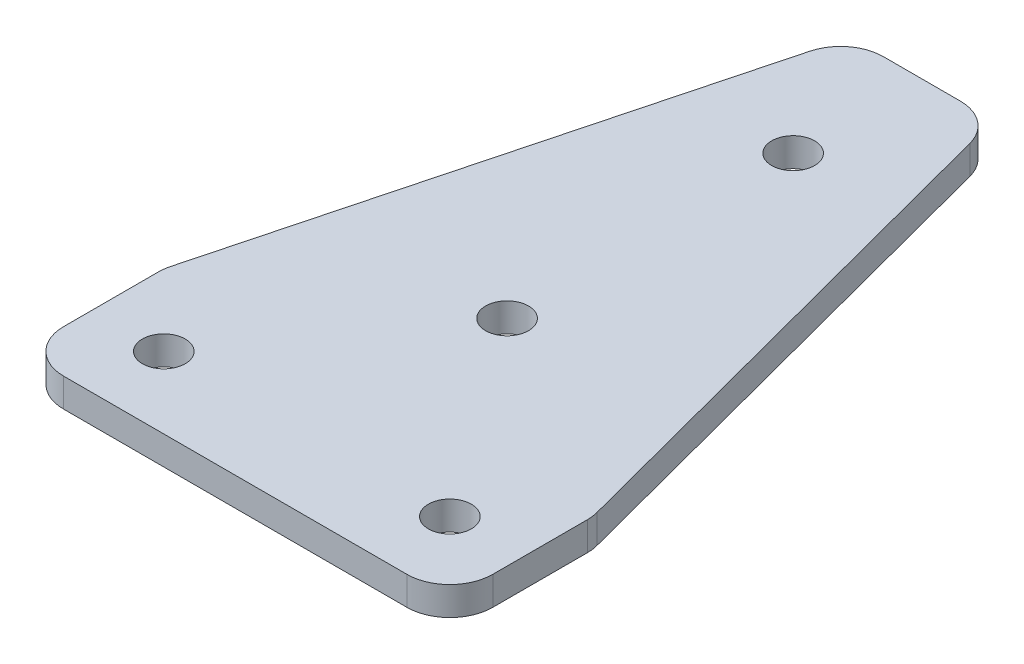
ISO-10303-21;
HEADER;
FILE_DESCRIPTION(('STEP AP214'),'2;1');
FILE_NAME('part.step','',(''),(''),'','','');
FILE_SCHEMA(('AUTOMOTIVE_DESIGN { 1 0 10303 214 1 1 1 1 }'));
ENDSEC;
DATA;
#1=APPLICATION_CONTEXT('core data for automotive mechanical design processes');
#2=APPLICATION_PROTOCOL_DEFINITION('international standard','automotive_design',2000,#1);
#3=PRODUCT_CONTEXT('',#1,'mechanical');
#4=PRODUCT('Part','Part','',(#3));
#5=PRODUCT_RELATED_PRODUCT_CATEGORY('part','',(#4));
#6=PRODUCT_DEFINITION_FORMATION('','',#4);
#7=PRODUCT_DEFINITION_CONTEXT('part definition',#1,'design');
#8=PRODUCT_DEFINITION('design','',#6,#7);
#9=PRODUCT_DEFINITION_SHAPE('','',#8);
#10=(LENGTH_UNIT() NAMED_UNIT(*) SI_UNIT(.MILLI.,.METRE.));
#11=(NAMED_UNIT(*) PLANE_ANGLE_UNIT() SI_UNIT($,.RADIAN.));
#12=(NAMED_UNIT(*) SI_UNIT($,.STERADIAN.) SOLID_ANGLE_UNIT());
#13=UNCERTAINTY_MEASURE_WITH_UNIT(LENGTH_MEASURE(1.E-05),#10,'distance_accuracy_value','');
#14=(GEOMETRIC_REPRESENTATION_CONTEXT(3) GLOBAL_UNCERTAINTY_ASSIGNED_CONTEXT((#13)) GLOBAL_UNIT_ASSIGNED_CONTEXT((#10,
#11,#12)) REPRESENTATION_CONTEXT('',''));
#15=CARTESIAN_POINT('',(0.,0.,0.));
#16=DIRECTION('',(0.,0.,1.));
#17=DIRECTION('',(1.,0.,0.));
#18=AXIS2_PLACEMENT_3D('',#15,#16,#17);
#19=CARTESIAN_POINT('',(0.,2.,0.));
#20=DIRECTION('',(0.,-1.,0.));
#21=DIRECTION('',(0.,0.,-1.));
#22=AXIS2_PLACEMENT_3D('',#19,#20,#21);
#23=PLANE('',#22);
#24=DIRECTION('',(-1.,0.,0.));
#25=VECTOR('',#24,1.);
#26=CARTESIAN_POINT('',(-5.,2.,-48.));
#27=LINE('',#26,#25);
#28=CARTESIAN_POINT('',(2.6873343098334,2.,-48.));
#29=VERTEX_POINT('',#28);
#30=CARTESIAN_POINT('',(-2.6873343098334,2.,-48.));
#31=VERTEX_POINT('',#30);
#32=EDGE_CURVE('E177',#29,#31,#27,.T.);
#33=ORIENTED_EDGE('',*,*,#32,.T.);
#34=CARTESIAN_POINT('',(-2.6873343098334,2.,-45.));
#35=DIRECTION('',(0.,-1.,0.));
#36=DIRECTION('',(0.,0.,-1.));
#37=AXIS2_PLACEMENT_3D('',#34,#35,#36);
#38=CIRCLE('',#37,3.);
#39=CARTESIAN_POINT('',(-5.58855792162133,2.,-45.7634798978389));
#40=VERTEX_POINT('',#39);
#41=EDGE_CURVE('E226',#31,#40,#38,.F.);
#42=ORIENTED_EDGE('',*,*,#41,.T.);
#43=DIRECTION('',(-0.254493299279644,0.,0.967074537262646));
#44=VECTOR('',#43,1.);
#45=CARTESIAN_POINT('',(-15.,2.,-10.));
#46=LINE('',#45,#44);
#47=CARTESIAN_POINT('',(-14.9012236117879,2.,-10.3753502752058));
#48=VERTEX_POINT('',#47);
#49=EDGE_CURVE('E159',#40,#48,#46,.T.);
#50=ORIENTED_EDGE('',*,*,#49,.T.);
#51=CARTESIAN_POINT('',(-12.,2.,-9.61187037736691));
#52=DIRECTION('',(0.,-1.,0.));
#53=DIRECTION('',(0.,0.,-1.));
#54=AXIS2_PLACEMENT_3D('',#51,#52,#53);
#55=CIRCLE('',#54,3.);
#56=CARTESIAN_POINT('',(-15.,2.,-9.61187037736691));
#57=VERTEX_POINT('',#56);
#58=EDGE_CURVE('E220',#48,#57,#55,.F.);
#59=ORIENTED_EDGE('',*,*,#58,.T.);
#60=DIRECTION('',(0.,0.,1.));
#61=VECTOR('',#60,1.);
#62=CARTESIAN_POINT('',(-15.,2.,-10.));
#63=LINE('',#62,#61);
#64=CARTESIAN_POINT('',(-15.,2.,-3.00000000000002));
#65=VERTEX_POINT('',#64);
#66=EDGE_CURVE('E259',#57,#65,#63,.T.);
#67=ORIENTED_EDGE('',*,*,#66,.T.);
#68=CARTESIAN_POINT('',(-12.,2.,-3.00000000000002));
#69=DIRECTION('',(0.,-1.,0.));
#70=DIRECTION('',(0.,0.,-1.));
#71=AXIS2_PLACEMENT_3D('',#68,#69,#70);
#72=CIRCLE('',#71,3.);
#73=CARTESIAN_POINT('',(-12.,2.,0.));
#74=VERTEX_POINT('',#73);
#75=EDGE_CURVE('E219',#65,#74,#72,.F.);
#76=ORIENTED_EDGE('',*,*,#75,.T.);
#77=DIRECTION('',(1.,0.,0.));
#78=VECTOR('',#77,1.);
#79=CARTESIAN_POINT('',(-15.,2.,0.));
#80=LINE('',#79,#78);
#81=CARTESIAN_POINT('',(12.,2.,0.));
#82=VERTEX_POINT('',#81);
#83=EDGE_CURVE('E272',#74,#82,#80,.T.);
#84=ORIENTED_EDGE('',*,*,#83,.T.);
#85=CARTESIAN_POINT('',(12.,2.,-3.));
#86=DIRECTION('',(0.,-1.,0.));
#87=DIRECTION('',(0.,0.,-1.));
#88=AXIS2_PLACEMENT_3D('',#85,#86,#87);
#89=CIRCLE('',#88,3.);
#90=CARTESIAN_POINT('',(15.,2.,-3.));
#91=VERTEX_POINT('',#90);
#92=EDGE_CURVE('E211',#82,#91,#89,.F.);
#93=ORIENTED_EDGE('',*,*,#92,.T.);
#94=DIRECTION('',(0.,0.,-1.));
#95=VECTOR('',#94,1.);
#96=CARTESIAN_POINT('',(15.,2.,-10.));
#97=LINE('',#96,#95);
#98=CARTESIAN_POINT('',(15.,2.,-9.61187037736689));
#99=VERTEX_POINT('',#98);
#100=EDGE_CURVE('E274',#91,#99,#97,.T.);
#101=ORIENTED_EDGE('',*,*,#100,.T.);
#102=CARTESIAN_POINT('',(12.,2.,-9.61187037736689));
#103=DIRECTION('',(0.,-1.,0.));
#104=DIRECTION('',(0.,0.,-1.));
#105=AXIS2_PLACEMENT_3D('',#102,#103,#104);
#106=CIRCLE('',#105,3.);
#107=CARTESIAN_POINT('',(14.9012236117879,2.,-10.3753502752058));
#108=VERTEX_POINT('',#107);
#109=EDGE_CURVE('E68',#99,#108,#106,.F.);
#110=ORIENTED_EDGE('',*,*,#109,.T.);
#111=DIRECTION('',(-0.254493299279644,0.,-0.967074537262646));
#112=VECTOR('',#111,1.);
#113=CARTESIAN_POINT('',(5.,2.,-48.));
#114=LINE('',#113,#112);
#115=CARTESIAN_POINT('',(5.58855792162134,2.,-45.7634798978389));
#116=VERTEX_POINT('',#115);
#117=EDGE_CURVE('E279',#108,#116,#114,.T.);
#118=ORIENTED_EDGE('',*,*,#117,.T.);
#119=CARTESIAN_POINT('',(2.6873343098334,2.,-45.));
#120=DIRECTION('',(0.,-1.,0.));
#121=DIRECTION('',(0.,0.,-1.));
#122=AXIS2_PLACEMENT_3D('',#119,#120,#121);
#123=CIRCLE('',#122,3.);
#124=EDGE_CURVE('E221',#116,#29,#123,.F.);
#125=ORIENTED_EDGE('',*,*,#124,.T.);
#126=EDGE_LOOP('',(#33,#42,#50,#59,#67,#76,#84,#93,#101,#110,#118,#125));
#127=FACE_BOUND('',#126,.T.);
#128=CARTESIAN_POINT('',(0.,2.,-39.));
#129=DIRECTION('',(0.,1.,0.));
#130=DIRECTION('',(0.,0.,1.));
#131=AXIS2_PLACEMENT_3D('',#128,#129,#130);
#132=CIRCLE('',#131,1.5);
#133=CARTESIAN_POINT('',(0.,2.,-37.5));
#134=VERTEX_POINT('',#133);
#135=EDGE_CURVE('E166',#134,#134,#132,.T.);
#136=ORIENTED_EDGE('',*,*,#135,.F.);
#137=EDGE_LOOP('',(#136));
#138=FACE_BOUND('',#137,.T.);
#139=CARTESIAN_POINT('',(0.,2.,-19.));
#140=DIRECTION('',(0.,1.,0.));
#141=DIRECTION('',(0.,0.,1.));
#142=AXIS2_PLACEMENT_3D('',#139,#140,#141);
#143=CIRCLE('',#142,1.5);
#144=CARTESIAN_POINT('',(0.,2.,-17.5));
#145=VERTEX_POINT('',#144);
#146=EDGE_CURVE('E462',#145,#145,#143,.T.);
#147=ORIENTED_EDGE('',*,*,#146,.F.);
#148=EDGE_LOOP('',(#147));
#149=FACE_BOUND('',#148,.T.);
#150=CARTESIAN_POINT('',(10.,2.,-5.));
#151=DIRECTION('',(0.,1.,0.));
#152=DIRECTION('',(0.,0.,1.));
#153=AXIS2_PLACEMENT_3D('',#150,#151,#152);
#154=CIRCLE('',#153,1.5);
#155=CARTESIAN_POINT('',(10.,2.,-3.5));
#156=VERTEX_POINT('',#155);
#157=EDGE_CURVE('E474',#156,#156,#154,.T.);
#158=ORIENTED_EDGE('',*,*,#157,.F.);
#159=EDGE_LOOP('',(#158));
#160=FACE_BOUND('',#159,.T.);
#161=CARTESIAN_POINT('',(-10.,2.,-5.));
#162=DIRECTION('',(0.,1.,0.));
#163=DIRECTION('',(0.,0.,1.));
#164=AXIS2_PLACEMENT_3D('',#161,#162,#163);
#165=CIRCLE('',#164,1.5);
#166=CARTESIAN_POINT('',(-10.,2.,-3.5));
#167=VERTEX_POINT('',#166);
#168=EDGE_CURVE('E477',#167,#167,#165,.T.);
#169=ORIENTED_EDGE('',*,*,#168,.F.);
#170=EDGE_LOOP('',(#169));
#171=FACE_BOUND('',#170,.T.);
#172=ADVANCED_FACE('F44',(#127,#138,#149,#160,#171),#23,.F.);
#173=CARTESIAN_POINT('',(0.,0.,0.));
#174=DIRECTION('',(0.,-1.,0.));
#175=DIRECTION('',(0.,0.,-1.));
#176=AXIS2_PLACEMENT_3D('',#173,#174,#175);
#177=PLANE('',#176);
#178=CARTESIAN_POINT('',(10.,0.,-5.));
#179=DIRECTION('',(0.,1.,0.));
#180=DIRECTION('',(0.,0.,1.));
#181=AXIS2_PLACEMENT_3D('',#178,#179,#180);
#182=CIRCLE('',#181,1.5);
#183=CARTESIAN_POINT('',(10.,0.,-3.5));
#184=VERTEX_POINT('',#183);
#185=EDGE_CURVE('E473',#184,#184,#182,.T.);
#186=ORIENTED_EDGE('',*,*,#185,.T.);
#187=EDGE_LOOP('',(#186));
#188=FACE_BOUND('',#187,.T.);
#189=CARTESIAN_POINT('',(0.,0.,-39.));
#190=DIRECTION('',(0.,1.,0.));
#191=DIRECTION('',(0.,0.,1.));
#192=AXIS2_PLACEMENT_3D('',#189,#190,#191);
#193=CIRCLE('',#192,1.5);
#194=CARTESIAN_POINT('',(0.,0.,-37.5));
#195=VERTEX_POINT('',#194);
#196=EDGE_CURVE('E176',#195,#195,#193,.T.);
#197=ORIENTED_EDGE('',*,*,#196,.T.);
#198=EDGE_LOOP('',(#197));
#199=FACE_BOUND('',#198,.T.);
#200=DIRECTION('',(-0.254493299279644,0.,0.967074537262646));
#201=VECTOR('',#200,1.);
#202=CARTESIAN_POINT('',(-15.,0.,-10.));
#203=LINE('',#202,#201);
#204=CARTESIAN_POINT('',(-5.58855792162133,0.,-45.7634798978389));
#205=VERTEX_POINT('',#204);
#206=CARTESIAN_POINT('',(-14.9012236117879,0.,-10.3753502752058));
#207=VERTEX_POINT('',#206);
#208=EDGE_CURVE('E152',#205,#207,#203,.T.);
#209=ORIENTED_EDGE('',*,*,#208,.F.);
#210=CARTESIAN_POINT('',(-2.6873343098334,0.,-45.));
#211=DIRECTION('',(0.,-1.,0.));
#212=DIRECTION('',(0.,0.,-1.));
#213=AXIS2_PLACEMENT_3D('',#210,#211,#212);
#214=CIRCLE('',#213,3.);
#215=CARTESIAN_POINT('',(-2.6873343098334,0.,-48.));
#216=VERTEX_POINT('',#215);
#217=EDGE_CURVE('E138',#205,#216,#214,.T.);
#218=ORIENTED_EDGE('',*,*,#217,.T.);
#219=DIRECTION('',(-1.,0.,0.));
#220=VECTOR('',#219,1.);
#221=CARTESIAN_POINT('',(-5.,0.,-48.));
#222=LINE('',#221,#220);
#223=CARTESIAN_POINT('',(2.6873343098334,0.,-48.));
#224=VERTEX_POINT('',#223);
#225=EDGE_CURVE('E195',#224,#216,#222,.T.);
#226=ORIENTED_EDGE('',*,*,#225,.F.);
#227=CARTESIAN_POINT('',(2.6873343098334,0.,-45.));
#228=DIRECTION('',(0.,-1.,0.));
#229=DIRECTION('',(0.,0.,-1.));
#230=AXIS2_PLACEMENT_3D('',#227,#228,#229);
#231=CIRCLE('',#230,3.);
#232=CARTESIAN_POINT('',(5.58855792162134,0.,-45.7634798978389));
#233=VERTEX_POINT('',#232);
#234=EDGE_CURVE('E149',#224,#233,#231,.T.);
#235=ORIENTED_EDGE('',*,*,#234,.T.);
#236=DIRECTION('',(-0.254493299279644,0.,-0.967074537262646));
#237=VECTOR('',#236,1.);
#238=CARTESIAN_POINT('',(5.,0.,-48.));
#239=LINE('',#238,#237);
#240=CARTESIAN_POINT('',(14.9012236117879,0.,-10.3753502752058));
#241=VERTEX_POINT('',#240);
#242=EDGE_CURVE('E186',#241,#233,#239,.T.);
#243=ORIENTED_EDGE('',*,*,#242,.F.);
#244=CARTESIAN_POINT('',(12.,0.,-9.61187037736689));
#245=DIRECTION('',(0.,-1.,0.));
#246=DIRECTION('',(0.,0.,-1.));
#247=AXIS2_PLACEMENT_3D('',#244,#245,#246);
#248=CIRCLE('',#247,3.);
#249=CARTESIAN_POINT('',(15.,0.,-9.61187037736689));
#250=VERTEX_POINT('',#249);
#251=EDGE_CURVE('E205',#241,#250,#248,.T.);
#252=ORIENTED_EDGE('',*,*,#251,.T.);
#253=DIRECTION('',(0.,0.,-1.));
#254=VECTOR('',#253,1.);
#255=CARTESIAN_POINT('',(15.,0.,-10.));
#256=LINE('',#255,#254);
#257=CARTESIAN_POINT('',(15.,0.,-3.));
#258=VERTEX_POINT('',#257);
#259=EDGE_CURVE('E184',#258,#250,#256,.T.);
#260=ORIENTED_EDGE('',*,*,#259,.F.);
#261=CARTESIAN_POINT('',(12.,0.,-3.));
#262=DIRECTION('',(0.,-1.,0.));
#263=DIRECTION('',(0.,0.,-1.));
#264=AXIS2_PLACEMENT_3D('',#261,#262,#263);
#265=CIRCLE('',#264,3.);
#266=CARTESIAN_POINT('',(12.,0.,0.));
#267=VERTEX_POINT('',#266);
#268=EDGE_CURVE('E160',#258,#267,#265,.T.);
#269=ORIENTED_EDGE('',*,*,#268,.T.);
#270=DIRECTION('',(1.,0.,0.));
#271=VECTOR('',#270,1.);
#272=CARTESIAN_POINT('',(-15.,0.,0.));
#273=LINE('',#272,#271);
#274=CARTESIAN_POINT('',(-12.,0.,0.));
#275=VERTEX_POINT('',#274);
#276=EDGE_CURVE('E173',#275,#267,#273,.T.);
#277=ORIENTED_EDGE('',*,*,#276,.F.);
#278=CARTESIAN_POINT('',(-12.,0.,-3.00000000000002));
#279=DIRECTION('',(0.,-1.,0.));
#280=DIRECTION('',(0.,0.,-1.));
#281=AXIS2_PLACEMENT_3D('',#278,#279,#280);
#282=CIRCLE('',#281,3.);
#283=CARTESIAN_POINT('',(-15.,0.,-3.00000000000002));
#284=VERTEX_POINT('',#283);
#285=EDGE_CURVE('E203',#275,#284,#282,.T.);
#286=ORIENTED_EDGE('',*,*,#285,.T.);
#287=DIRECTION('',(0.,0.,1.));
#288=VECTOR('',#287,1.);
#289=CARTESIAN_POINT('',(-15.,0.,-10.));
#290=LINE('',#289,#288);
#291=CARTESIAN_POINT('',(-15.,0.,-9.61187037736691));
#292=VERTEX_POINT('',#291);
#293=EDGE_CURVE('E170',#292,#284,#290,.T.);
#294=ORIENTED_EDGE('',*,*,#293,.F.);
#295=CARTESIAN_POINT('',(-12.,0.,-9.61187037736691));
#296=DIRECTION('',(0.,-1.,0.));
#297=DIRECTION('',(0.,0.,-1.));
#298=AXIS2_PLACEMENT_3D('',#295,#296,#297);
#299=CIRCLE('',#298,3.);
#300=EDGE_CURVE('E164',#292,#207,#299,.T.);
#301=ORIENTED_EDGE('',*,*,#300,.T.);
#302=EDGE_LOOP('',(#209,#218,#226,#235,#243,#252,#260,#269,#277,#286,#294,#301));
#303=FACE_BOUND('',#302,.T.);
#304=CARTESIAN_POINT('',(0.,0.,-19.));
#305=DIRECTION('',(0.,1.,0.));
#306=DIRECTION('',(0.,0.,1.));
#307=AXIS2_PLACEMENT_3D('',#304,#305,#306);
#308=CIRCLE('',#307,1.5);
#309=CARTESIAN_POINT('',(0.,0.,-17.5));
#310=VERTEX_POINT('',#309);
#311=EDGE_CURVE('E470',#310,#310,#308,.T.);
#312=ORIENTED_EDGE('',*,*,#311,.T.);
#313=EDGE_LOOP('',(#312));
#314=FACE_BOUND('',#313,.T.);
#315=CARTESIAN_POINT('',(-10.,0.,-5.));
#316=DIRECTION('',(0.,1.,0.));
#317=DIRECTION('',(0.,0.,1.));
#318=AXIS2_PLACEMENT_3D('',#315,#316,#317);
#319=CIRCLE('',#318,1.5);
#320=CARTESIAN_POINT('',(-10.,0.,-3.5));
#321=VERTEX_POINT('',#320);
#322=EDGE_CURVE('E482',#321,#321,#319,.T.);
#323=ORIENTED_EDGE('',*,*,#322,.T.);
#324=EDGE_LOOP('',(#323));
#325=FACE_BOUND('',#324,.T.);
#326=ADVANCED_FACE('F162',(#188,#199,#303,#314,#325),#177,.T.);
#327=CARTESIAN_POINT('',(-15.,2.,-10.));
#328=DIRECTION('',(0.967074537262646,0.,0.254493299279644));
#329=DIRECTION('',(0.254493299279644,0.,-0.967074537262647));
#330=AXIS2_PLACEMENT_3D('',#327,#328,#329);
#331=PLANE('',#330);
#332=ORIENTED_EDGE('',*,*,#49,.F.);
#333=DIRECTION('',(0.,-1.,0.));
#334=VECTOR('',#333,1.);
#335=CARTESIAN_POINT('',(-5.58855792162133,2.,-45.7634798978389));
#336=LINE('',#335,#334);
#337=EDGE_CURVE('E136',#40,#205,#336,.T.);
#338=ORIENTED_EDGE('',*,*,#337,.T.);
#339=ORIENTED_EDGE('',*,*,#208,.T.);
#340=DIRECTION('',(0.,-1.,0.));
#341=VECTOR('',#340,1.);
#342=CARTESIAN_POINT('',(-14.9012236117879,2.,-10.3753502752058));
#343=LINE('',#342,#341);
#344=EDGE_CURVE('E156',#207,#48,#343,.F.);
#345=ORIENTED_EDGE('',*,*,#344,.T.);
#346=EDGE_LOOP('',(#332,#338,#339,#345));
#347=FACE_BOUND('',#346,.T.);
#348=ADVANCED_FACE('F153',(#347),#331,.F.);
#349=CARTESIAN_POINT('',(-15.,2.,-10.));
#350=DIRECTION('',(1.,0.,0.));
#351=DIRECTION('',(0.,0.,-1.));
#352=AXIS2_PLACEMENT_3D('',#349,#350,#351);
#353=PLANE('',#352);
#354=ORIENTED_EDGE('',*,*,#293,.T.);
#355=DIRECTION('',(0.,-1.,0.));
#356=VECTOR('',#355,1.);
#357=CARTESIAN_POINT('',(-15.,2.,-3.00000000000002));
#358=LINE('',#357,#356);
#359=EDGE_CURVE('E11',#284,#65,#358,.F.);
#360=ORIENTED_EDGE('',*,*,#359,.T.);
#361=ORIENTED_EDGE('',*,*,#66,.F.);
#362=DIRECTION('',(0.,-1.,0.));
#363=VECTOR('',#362,1.);
#364=CARTESIAN_POINT('',(-15.,2.,-9.61187037736691));
#365=LINE('',#364,#363);
#366=EDGE_CURVE('E53',#57,#292,#365,.T.);
#367=ORIENTED_EDGE('',*,*,#366,.T.);
#368=EDGE_LOOP('',(#354,#360,#361,#367));
#369=FACE_BOUND('',#368,.T.);
#370=ADVANCED_FACE('F253',(#369),#353,.F.);
#371=CARTESIAN_POINT('',(-15.,2.,0.));
#372=DIRECTION('',(0.,0.,-1.));
#373=DIRECTION('',(-1.,0.,0.));
#374=AXIS2_PLACEMENT_3D('',#371,#372,#373);
#375=PLANE('',#374);
#376=ORIENTED_EDGE('',*,*,#83,.F.);
#377=DIRECTION('',(0.,-1.,0.));
#378=VECTOR('',#377,1.);
#379=CARTESIAN_POINT('',(-12.,2.,0.));
#380=LINE('',#379,#378);
#381=EDGE_CURVE('E250',#74,#275,#380,.T.);
#382=ORIENTED_EDGE('',*,*,#381,.T.);
#383=ORIENTED_EDGE('',*,*,#276,.T.);
#384=DIRECTION('',(0.,-1.,0.));
#385=VECTOR('',#384,1.);
#386=CARTESIAN_POINT('',(12.,2.,0.));
#387=LINE('',#386,#385);
#388=EDGE_CURVE('E242',#267,#82,#387,.F.);
#389=ORIENTED_EDGE('',*,*,#388,.T.);
#390=EDGE_LOOP('',(#376,#382,#383,#389));
#391=FACE_BOUND('',#390,.T.);
#392=ADVANCED_FACE('F267',(#391),#375,.F.);
#393=CARTESIAN_POINT('',(15.,2.,-10.));
#394=DIRECTION('',(-1.,0.,0.));
#395=DIRECTION('',(0.,0.,1.));
#396=AXIS2_PLACEMENT_3D('',#393,#394,#395);
#397=PLANE('',#396);
#398=ORIENTED_EDGE('',*,*,#259,.T.);
#399=DIRECTION('',(0.,-1.,0.));
#400=VECTOR('',#399,1.);
#401=CARTESIAN_POINT('',(15.,2.,-9.61187037736689));
#402=LINE('',#401,#400);
#403=EDGE_CURVE('E241',#250,#99,#402,.F.);
#404=ORIENTED_EDGE('',*,*,#403,.T.);
#405=ORIENTED_EDGE('',*,*,#100,.F.);
#406=DIRECTION('',(0.,-1.,0.));
#407=VECTOR('',#406,1.);
#408=CARTESIAN_POINT('',(15.,2.,-3.));
#409=LINE('',#408,#407);
#410=EDGE_CURVE('E240',#91,#258,#409,.T.);
#411=ORIENTED_EDGE('',*,*,#410,.T.);
#412=EDGE_LOOP('',(#398,#404,#405,#411));
#413=FACE_BOUND('',#412,.T.);
#414=ADVANCED_FACE('F301',(#413),#397,.F.);
#415=CARTESIAN_POINT('',(5.,2.,-48.));
#416=DIRECTION('',(-0.967074537262647,0.,0.254493299279644));
#417=DIRECTION('',(0.254493299279644,0.,0.967074537262647));
#418=AXIS2_PLACEMENT_3D('',#415,#416,#417);
#419=PLANE('',#418);
#420=ORIENTED_EDGE('',*,*,#242,.T.);
#421=DIRECTION('',(0.,-1.,0.));
#422=VECTOR('',#421,1.);
#423=CARTESIAN_POINT('',(5.58855792162134,2.,-45.7634798978389));
#424=LINE('',#423,#422);
#425=EDGE_CURVE('E62',#233,#116,#424,.F.);
#426=ORIENTED_EDGE('',*,*,#425,.T.);
#427=ORIENTED_EDGE('',*,*,#117,.F.);
#428=DIRECTION('',(0.,-1.,0.));
#429=VECTOR('',#428,1.);
#430=CARTESIAN_POINT('',(14.9012236117879,2.,-10.3753502752058));
#431=LINE('',#430,#429);
#432=EDGE_CURVE('E233',#108,#241,#431,.T.);
#433=ORIENTED_EDGE('',*,*,#432,.T.);
#434=EDGE_LOOP('',(#420,#426,#427,#433));
#435=FACE_BOUND('',#434,.T.);
#436=ADVANCED_FACE('F295',(#435),#419,.F.);
#437=CARTESIAN_POINT('',(-5.,2.,-48.));
#438=DIRECTION('',(0.,0.,1.));
#439=DIRECTION('',(1.,0.,0.));
#440=AXIS2_PLACEMENT_3D('',#437,#438,#439);
#441=PLANE('',#440);
#442=ORIENTED_EDGE('',*,*,#225,.T.);
#443=DIRECTION('',(0.,-1.,0.));
#444=VECTOR('',#443,1.);
#445=CARTESIAN_POINT('',(-2.6873343098334,2.,-48.));
#446=LINE('',#445,#444);
#447=EDGE_CURVE('E142',#216,#31,#446,.F.);
#448=ORIENTED_EDGE('',*,*,#447,.T.);
#449=ORIENTED_EDGE('',*,*,#32,.F.);
#450=DIRECTION('',(0.,-1.,0.));
#451=VECTOR('',#450,1.);
#452=CARTESIAN_POINT('',(2.6873343098334,2.,-48.));
#453=LINE('',#452,#451);
#454=EDGE_CURVE('E150',#29,#224,#453,.T.);
#455=ORIENTED_EDGE('',*,*,#454,.T.);
#456=EDGE_LOOP('',(#442,#448,#449,#455));
#457=FACE_BOUND('',#456,.T.);
#458=ADVANCED_FACE('F286',(#457),#441,.F.);
#459=CARTESIAN_POINT('',(0.,2.,-39.));
#460=DIRECTION('',(0.,-1.,0.));
#461=DIRECTION('',(0.,0.,-1.));
#462=AXIS2_PLACEMENT_3D('',#459,#460,#461);
#463=CYLINDRICAL_SURFACE('',#462,1.5);
#464=ORIENTED_EDGE('',*,*,#135,.T.);
#465=EDGE_LOOP('',(#464));
#466=FACE_BOUND('',#465,.T.);
#467=ORIENTED_EDGE('',*,*,#196,.F.);
#468=EDGE_LOOP('',(#467));
#469=FACE_BOUND('',#468,.T.);
#470=ADVANCED_FACE('F316',(#466,#469),#463,.F.);
#471=CARTESIAN_POINT('',(0.,2.,-19.));
#472=DIRECTION('',(0.,-1.,0.));
#473=DIRECTION('',(0.,0.,-1.));
#474=AXIS2_PLACEMENT_3D('',#471,#472,#473);
#475=CYLINDRICAL_SURFACE('',#474,1.5);
#476=ORIENTED_EDGE('',*,*,#146,.T.);
#477=EDGE_LOOP('',(#476));
#478=FACE_BOUND('',#477,.T.);
#479=ORIENTED_EDGE('',*,*,#311,.F.);
#480=EDGE_LOOP('',(#479));
#481=FACE_BOUND('',#480,.T.);
#482=ADVANCED_FACE('F390',(#478,#481),#475,.F.);
#483=CARTESIAN_POINT('',(10.,2.,-5.));
#484=DIRECTION('',(0.,-1.,0.));
#485=DIRECTION('',(0.,0.,-1.));
#486=AXIS2_PLACEMENT_3D('',#483,#484,#485);
#487=CYLINDRICAL_SURFACE('',#486,1.5);
#488=ORIENTED_EDGE('',*,*,#157,.T.);
#489=EDGE_LOOP('',(#488));
#490=FACE_BOUND('',#489,.T.);
#491=ORIENTED_EDGE('',*,*,#185,.F.);
#492=EDGE_LOOP('',(#491));
#493=FACE_BOUND('',#492,.T.);
#494=ADVANCED_FACE('F377',(#490,#493),#487,.F.);
#495=CARTESIAN_POINT('',(-10.,2.,-5.));
#496=DIRECTION('',(0.,-1.,0.));
#497=DIRECTION('',(0.,0.,-1.));
#498=AXIS2_PLACEMENT_3D('',#495,#496,#497);
#499=CYLINDRICAL_SURFACE('',#498,1.5);
#500=ORIENTED_EDGE('',*,*,#168,.T.);
#501=EDGE_LOOP('',(#500));
#502=FACE_BOUND('',#501,.T.);
#503=ORIENTED_EDGE('',*,*,#322,.F.);
#504=EDGE_LOOP('',(#503));
#505=FACE_BOUND('',#504,.T.);
#506=ADVANCED_FACE('F337',(#502,#505),#499,.F.);
#507=CARTESIAN_POINT('',(-2.6873343098334,2.,-45.));
#508=DIRECTION('',(0.,-1.,0.));
#509=DIRECTION('',(0.,0.,-1.));
#510=AXIS2_PLACEMENT_3D('',#507,#508,#509);
#511=CYLINDRICAL_SURFACE('',#510,3.);
#512=ORIENTED_EDGE('',*,*,#41,.F.);
#513=ORIENTED_EDGE('',*,*,#447,.F.);
#514=ORIENTED_EDGE('',*,*,#217,.F.);
#515=ORIENTED_EDGE('',*,*,#337,.F.);
#516=EDGE_LOOP('',(#512,#513,#514,#515));
#517=FACE_BOUND('',#516,.T.);
#518=ADVANCED_FACE('F140',(#517),#511,.T.);
#519=CARTESIAN_POINT('',(2.6873343098334,2.,-45.));
#520=DIRECTION('',(0.,-1.,0.));
#521=DIRECTION('',(0.,0.,-1.));
#522=AXIS2_PLACEMENT_3D('',#519,#520,#521);
#523=CYLINDRICAL_SURFACE('',#522,3.);
#524=ORIENTED_EDGE('',*,*,#124,.F.);
#525=ORIENTED_EDGE('',*,*,#425,.F.);
#526=ORIENTED_EDGE('',*,*,#234,.F.);
#527=ORIENTED_EDGE('',*,*,#454,.F.);
#528=EDGE_LOOP('',(#524,#525,#526,#527));
#529=FACE_BOUND('',#528,.T.);
#530=ADVANCED_FACE('F292',(#529),#523,.T.);
#531=CARTESIAN_POINT('',(12.,2.,-9.61187037736689));
#532=DIRECTION('',(0.,-1.,0.));
#533=DIRECTION('',(0.,0.,-1.));
#534=AXIS2_PLACEMENT_3D('',#531,#532,#533);
#535=CYLINDRICAL_SURFACE('',#534,3.);
#536=ORIENTED_EDGE('',*,*,#109,.F.);
#537=ORIENTED_EDGE('',*,*,#403,.F.);
#538=ORIENTED_EDGE('',*,*,#251,.F.);
#539=ORIENTED_EDGE('',*,*,#432,.F.);
#540=EDGE_LOOP('',(#536,#537,#538,#539));
#541=FACE_BOUND('',#540,.T.);
#542=ADVANCED_FACE('F300',(#541),#535,.T.);
#543=CARTESIAN_POINT('',(-12.,2.,-3.00000000000002));
#544=DIRECTION('',(0.,-1.,0.));
#545=DIRECTION('',(0.,0.,-1.));
#546=AXIS2_PLACEMENT_3D('',#543,#544,#545);
#547=CYLINDRICAL_SURFACE('',#546,3.);
#548=ORIENTED_EDGE('',*,*,#75,.F.);
#549=ORIENTED_EDGE('',*,*,#359,.F.);
#550=ORIENTED_EDGE('',*,*,#285,.F.);
#551=ORIENTED_EDGE('',*,*,#381,.F.);
#552=EDGE_LOOP('',(#548,#549,#550,#551));
#553=FACE_BOUND('',#552,.T.);
#554=ADVANCED_FACE('F264',(#553),#547,.T.);
#555=CARTESIAN_POINT('',(-12.,2.,-9.61187037736691));
#556=DIRECTION('',(0.,-1.,0.));
#557=DIRECTION('',(0.,0.,-1.));
#558=AXIS2_PLACEMENT_3D('',#555,#556,#557);
#559=CYLINDRICAL_SURFACE('',#558,3.);
#560=ORIENTED_EDGE('',*,*,#58,.F.);
#561=ORIENTED_EDGE('',*,*,#344,.F.);
#562=ORIENTED_EDGE('',*,*,#300,.F.);
#563=ORIENTED_EDGE('',*,*,#366,.F.);
#564=EDGE_LOOP('',(#560,#561,#562,#563));
#565=FACE_BOUND('',#564,.T.);
#566=ADVANCED_FACE('F306',(#565),#559,.T.);
#567=CARTESIAN_POINT('',(12.,2.,-3.));
#568=DIRECTION('',(0.,-1.,0.));
#569=DIRECTION('',(0.,0.,-1.));
#570=AXIS2_PLACEMENT_3D('',#567,#568,#569);
#571=CYLINDRICAL_SURFACE('',#570,3.);
#572=ORIENTED_EDGE('',*,*,#92,.F.);
#573=ORIENTED_EDGE('',*,*,#388,.F.);
#574=ORIENTED_EDGE('',*,*,#268,.F.);
#575=ORIENTED_EDGE('',*,*,#410,.F.);
#576=EDGE_LOOP('',(#572,#573,#574,#575));
#577=FACE_BOUND('',#576,.T.);
#578=ADVANCED_FACE('F50',(#577),#571,.T.);
#579=CLOSED_SHELL('',(#172,#326,#348,#370,#392,#414,#436,#458,#470,#482,#494,#506,#518,#530,
#542,#554,#566,#578));
#580=MANIFOLD_SOLID_BREP('B2',#579);
#581=ADVANCED_BREP_SHAPE_REPRESENTATION('',(#18,#580),#14);
#582=SHAPE_DEFINITION_REPRESENTATION(#9,#581);
ENDSEC;
END-ISO-10303-21;
